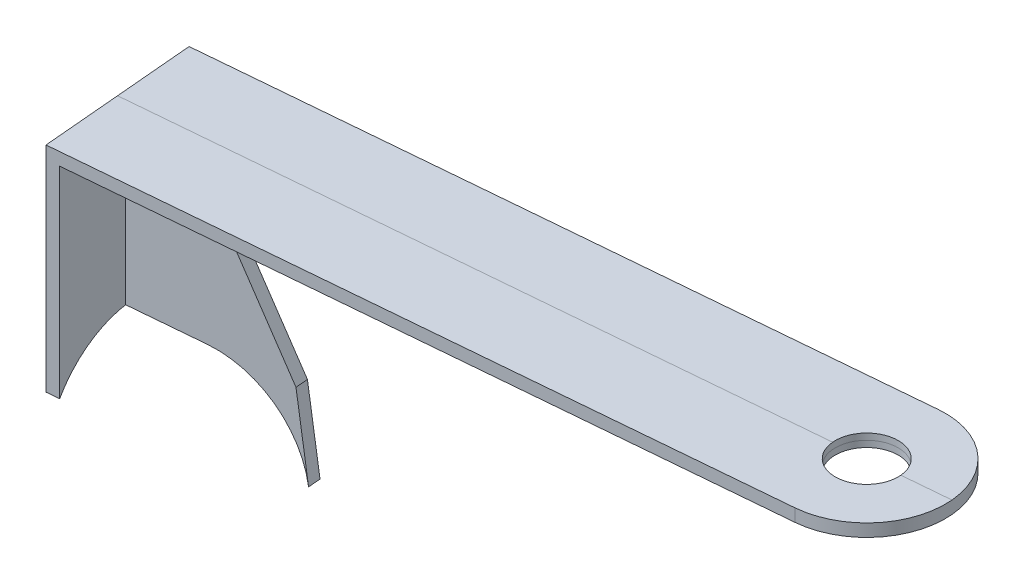
ISO-10303-21;
HEADER;
FILE_DESCRIPTION(('STEP AP214'),'2;1');
FILE_NAME('part.step','',(''),(''),'','','');
FILE_SCHEMA(('AUTOMOTIVE_DESIGN { 1 0 10303 214 1 1 1 1 }'));
ENDSEC;
DATA;
#1=APPLICATION_CONTEXT('core data for automotive mechanical design processes');
#2=APPLICATION_PROTOCOL_DEFINITION('international standard','automotive_design',2000,#1);
#3=PRODUCT_CONTEXT('',#1,'mechanical');
#4=PRODUCT('Part','Part','',(#3));
#5=PRODUCT_RELATED_PRODUCT_CATEGORY('part','',(#4));
#6=PRODUCT_DEFINITION_FORMATION('','',#4);
#7=PRODUCT_DEFINITION_CONTEXT('part definition',#1,'design');
#8=PRODUCT_DEFINITION('design','',#6,#7);
#9=PRODUCT_DEFINITION_SHAPE('','',#8);
#10=(LENGTH_UNIT() NAMED_UNIT(*) SI_UNIT(.MILLI.,.METRE.));
#11=(NAMED_UNIT(*) PLANE_ANGLE_UNIT() SI_UNIT($,.RADIAN.));
#12=(NAMED_UNIT(*) SI_UNIT($,.STERADIAN.) SOLID_ANGLE_UNIT());
#13=UNCERTAINTY_MEASURE_WITH_UNIT(LENGTH_MEASURE(1.E-05),#10,'distance_accuracy_value','');
#14=(GEOMETRIC_REPRESENTATION_CONTEXT(3) GLOBAL_UNCERTAINTY_ASSIGNED_CONTEXT((#13)) GLOBAL_UNIT_ASSIGNED_CONTEXT((#10,
#11,#12)) REPRESENTATION_CONTEXT('',''));
#15=CARTESIAN_POINT('',(0.,0.,0.));
#16=DIRECTION('',(0.,0.,1.));
#17=DIRECTION('',(1.,0.,0.));
#18=AXIS2_PLACEMENT_3D('',#15,#16,#17);
#19=CARTESIAN_POINT('',(95.5283362919159,42.2871579513113,-67.7014814945898));
#20=DIRECTION('',(0.,-1.,0.));
#21=DIRECTION('',(0.,0.,-1.));
#22=AXIS2_PLACEMENT_3D('',#19,#20,#21);
#23=CYLINDRICAL_SURFACE('',#22,5.00000000000001);
#24=CARTESIAN_POINT('',(95.5283362919159,40.2871579513113,-67.7014814945898));
#25=DIRECTION('',(0.,1.,0.));
#26=DIRECTION('',(0.,0.,1.));
#27=AXIS2_PLACEMENT_3D('',#24,#25,#26);
#28=CIRCLE('',#27,5.00000000000001);
#29=CARTESIAN_POINT('',(95.5283362919159,40.2871579513113,-62.7014814945897));
#30=VERTEX_POINT('',#29);
#31=EDGE_CURVE('E177',#30,#30,#28,.T.);
#32=ORIENTED_EDGE('',*,*,#31,.F.);
#33=EDGE_LOOP('',(#32));
#34=FACE_BOUND('',#33,.T.);
#35=CARTESIAN_POINT('',(95.5283362919159,41.2871579513113,-67.7014814945898));
#36=DIRECTION('',(0.,1.,0.));
#37=DIRECTION('',(0.,0.,1.));
#38=AXIS2_PLACEMENT_3D('',#35,#36,#37);
#39=CIRCLE('',#38,5.00000000000001);
#40=CARTESIAN_POINT('',(95.5283362919159,41.2871579513113,-62.7014814945897));
#41=VERTEX_POINT('',#40);
#42=EDGE_CURVE('E12',#41,#41,#39,.T.);
#43=ORIENTED_EDGE('',*,*,#42,.T.);
#44=EDGE_LOOP('',(#43));
#45=FACE_BOUND('',#44,.T.);
#46=ADVANCED_FACE('F50',(#34,#45),#23,.F.);
#47=CARTESIAN_POINT('',(95.5283362919159,42.2871579513113,-67.7014814945898));
#48=DIRECTION('',(0.,1.,0.));
#49=DIRECTION('',(0.,0.,1.));
#50=AXIS2_PLACEMENT_3D('',#47,#48,#49);
#51=PLANE('',#50);
#52=CARTESIAN_POINT('',(95.5283362919159,42.2871579513113,-67.7014814945898));
#53=DIRECTION('',(0.,1.,0.));
#54=DIRECTION('',(0.,0.,1.));
#55=AXIS2_PLACEMENT_3D('',#52,#53,#54);
#56=CIRCLE('',#55,12.5);
#57=CARTESIAN_POINT('',(96.6177830762615,42.2871579513113,-55.2490477684429));
#58=VERTEX_POINT('',#57);
#59=CARTESIAN_POINT('',(107.980770018063,42.2871579513113,-68.7909282789354));
#60=VERTEX_POINT('',#59);
#61=EDGE_CURVE('E288',#58,#60,#56,.T.);
#62=ORIENTED_EDGE('',*,*,#61,.T.);
#63=DIRECTION('',(-0.996194698091746,0.,0.087155742747652));
#64=VECTOR('',#63,1.);
#65=CARTESIAN_POINT('',(95.5283362919159,42.2871579513113,-67.7014814945898));
#66=LINE('',#65,#64);
#67=CARTESIAN_POINT('',(100.509309782375,42.2871579513113,-68.137260208328));
#68=VERTEX_POINT('',#67);
#69=EDGE_CURVE('E60',#60,#68,#66,.T.);
#70=ORIENTED_EDGE('',*,*,#69,.T.);
#71=CARTESIAN_POINT('',(95.5283362919159,42.2871579513113,-67.7014814945898));
#72=DIRECTION('',(0.,1.,0.));
#73=DIRECTION('',(0.,0.,1.));
#74=AXIS2_PLACEMENT_3D('',#71,#72,#73);
#75=CIRCLE('',#74,5.00000000000001);
#76=CARTESIAN_POINT('',(90.5473628014572,42.2871579513113,-67.2657027808515));
#77=VERTEX_POINT('',#76);
#78=EDGE_CURVE('E281',#77,#68,#75,.T.);
#79=ORIENTED_EDGE('',*,*,#78,.F.);
#80=CARTESIAN_POINT('',(-13.8897548470803,42.2871579513113,-58.1286389352819));
#81=VERTEX_POINT('',#80);
#82=EDGE_CURVE('E67',#77,#81,#66,.T.);
#83=ORIENTED_EDGE('',*,*,#82,.T.);
#84=DIRECTION('',(0.0871557427476517,0.,0.996194698091746));
#85=VECTOR('',#84,1.);
#86=CARTESIAN_POINT('',(-14.9792016314259,42.2871579513113,-70.5810726614287));
#87=LINE('',#86,#85);
#88=CARTESIAN_POINT('',(-12.8003080627346,42.2871579513113,-45.6762052091351));
#89=VERTEX_POINT('',#88);
#90=EDGE_CURVE('E222',#81,#89,#87,.T.);
#91=ORIENTED_EDGE('',*,*,#90,.T.);
#92=DIRECTION('',(0.996194698091746,0.,-0.087155742747652));
#93=VECTOR('',#92,1.);
#94=CARTESIAN_POINT('',(-12.8003080627346,42.2871579513113,-45.6762052091351));
#95=LINE('',#94,#93);
#96=EDGE_CURVE('E221',#89,#58,#95,.T.);
#97=ORIENTED_EDGE('',*,*,#96,.T.);
#98=EDGE_LOOP('',(#62,#70,#79,#83,#91,#97));
#99=FACE_BOUND('',#98,.T.);
#100=ADVANCED_FACE('F316',(#99),#51,.T.);
#101=CARTESIAN_POINT('',(-11.8973654508968,0.,-58.3029504207772));
#102=DIRECTION('',(-0.996194698091746,0.,0.0871557427476517));
#103=DIRECTION('',(-0.0871557427476518,0.,-0.996194698091746));
#104=AXIS2_PLACEMENT_3D('',#101,#102,#103);
#105=PLANE('',#104);
#106=DIRECTION('',(0.,1.,0.));
#107=VECTOR('',#106,1.);
#108=CARTESIAN_POINT('',(-11.9845211936444,40.2871579513113,-59.299145118869));
#109=LINE('',#108,#107);
#110=CARTESIAN_POINT('',(-11.9845211936444,15.,-59.299145118869));
#111=VERTEX_POINT('',#110);
#112=CARTESIAN_POINT('',(-11.9845211936444,40.2871579513113,-59.299145118869));
#113=VERTEX_POINT('',#112);
#114=EDGE_CURVE('E159',#111,#113,#109,.T.);
#115=ORIENTED_EDGE('',*,*,#114,.F.);
#116=DIRECTION('',(0.0871557427476518,0.,0.996194698091746));
#117=VECTOR('',#116,1.);
#118=CARTESIAN_POINT('',(-11.9845211936444,15.,-59.299145118869));
#119=LINE('',#118,#117);
#120=CARTESIAN_POINT('',(-11.8973654508968,15.,-58.3029504207772));
#121=VERTEX_POINT('',#120);
#122=EDGE_CURVE('E169',#111,#121,#119,.T.);
#123=ORIENTED_EDGE('',*,*,#122,.T.);
#124=CARTESIAN_POINT('',(-11.8973654508968,0.,-58.3029504207772));
#125=DIRECTION('',(0.996194698091746,0.,-0.0871557427476517));
#126=DIRECTION('',(-0.0871557427476518,0.,-0.996194698091746));
#127=AXIS2_PLACEMENT_3D('',#124,#125,#126);
#128=CIRCLE('',#127,15.);
#129=CARTESIAN_POINT('',(-12.9868122352424,8.2915619758885,-70.755384146924));
#130=VERTEX_POINT('',#129);
#131=EDGE_CURVE('E198',#130,#121,#128,.T.);
#132=ORIENTED_EDGE('',*,*,#131,.F.);
#133=DIRECTION('',(0.,-1.,0.));
#134=VECTOR('',#133,1.);
#135=CARTESIAN_POINT('',(-12.9868122352424,8.2915619758885,-70.755384146924));
#136=LINE('',#135,#134);
#137=CARTESIAN_POINT('',(-12.9868122352424,40.2871579513113,-70.755384146924));
#138=VERTEX_POINT('',#137);
#139=EDGE_CURVE('E246',#138,#130,#136,.T.);
#140=ORIENTED_EDGE('',*,*,#139,.F.);
#141=DIRECTION('',(-0.0871557427476519,0.,-0.996194698091746));
#142=VECTOR('',#141,1.);
#143=CARTESIAN_POINT('',(-12.9868122352424,40.2871579513113,-70.755384146924));
#144=LINE('',#143,#142);
#145=EDGE_CURVE('E182',#113,#138,#144,.T.);
#146=ORIENTED_EDGE('',*,*,#145,.F.);
#147=EDGE_LOOP('',(#115,#123,#132,#140,#146));
#148=FACE_BOUND('',#147,.T.);
#149=ADVANCED_FACE('F180',(#148),#105,.F.);
#150=CARTESIAN_POINT('',(-11.8102097081491,15.,-57.3067557226855));
#151=VERTEX_POINT('',#150);
#152=EDGE_CURVE('E173',#121,#151,#119,.T.);
#153=ORIENTED_EDGE('',*,*,#152,.T.);
#154=DIRECTION('',(0.,1.,0.));
#155=VECTOR('',#154,1.);
#156=CARTESIAN_POINT('',(-11.8102097081491,40.2871579513113,-57.3067557226855));
#157=LINE('',#156,#155);
#158=CARTESIAN_POINT('',(-11.8102097081491,40.2871579513113,-57.3067557226855));
#159=VERTEX_POINT('',#158);
#160=EDGE_CURVE('E343',#151,#159,#157,.T.);
#161=ORIENTED_EDGE('',*,*,#160,.T.);
#162=CARTESIAN_POINT('',(-10.8079186665511,40.2871579513113,-45.8505166946304));
#163=VERTEX_POINT('',#162);
#164=EDGE_CURVE('E209',#163,#159,#144,.T.);
#165=ORIENTED_EDGE('',*,*,#164,.F.);
#166=DIRECTION('',(0.,1.,0.));
#167=VECTOR('',#166,1.);
#168=CARTESIAN_POINT('',(-10.8079186665511,40.2871579513113,-45.8505166946304));
#169=LINE('',#168,#167);
#170=CARTESIAN_POINT('',(-10.8079186665511,8.2915619758885,-45.8505166946304));
#171=VERTEX_POINT('',#170);
#172=EDGE_CURVE('E203',#171,#163,#169,.T.);
#173=ORIENTED_EDGE('',*,*,#172,.F.);
#174=EDGE_CURVE('E204',#121,#171,#128,.T.);
#175=ORIENTED_EDGE('',*,*,#174,.F.);
#176=EDGE_LOOP('',(#153,#161,#165,#173,#175));
#177=FACE_BOUND('',#176,.T.);
#178=ADVANCED_FACE('F342',(#177),#105,.F.);
#179=CARTESIAN_POINT('',(95.5283362919159,40.2871579513113,-67.7014814945898));
#180=DIRECTION('',(0.,1.,0.));
#181=DIRECTION('',(0.,0.,1.));
#182=AXIS2_PLACEMENT_3D('',#179,#180,#181);
#183=PLANE('',#182);
#184=ORIENTED_EDGE('',*,*,#31,.T.);
#185=EDGE_LOOP('',(#184));
#186=FACE_BOUND('',#185,.T.);
#187=DIRECTION('',(0.996194698091746,0.,-0.0871557427476521));
#188=VECTOR('',#187,1.);
#189=CARTESIAN_POINT('',(-2.02257421272699,40.2871579513113,-60.1707025463455));
#190=LINE('',#189,#188);
#191=CARTESIAN_POINT('',(-2.02257421272699,40.2871579513113,-60.1707025463455));
#192=VERTEX_POINT('',#191);
#193=EDGE_CURVE('E183',#113,#192,#190,.T.);
#194=ORIENTED_EDGE('',*,*,#193,.F.);
#195=ORIENTED_EDGE('',*,*,#145,.T.);
#196=DIRECTION('',(-0.996194698091746,0.,0.0871557427476518));
#197=VECTOR('',#196,1.);
#198=CARTESIAN_POINT('',(-14.9792016314259,40.2871579513113,-70.5810726614287));
#199=LINE('',#198,#197);
#200=CARTESIAN_POINT('',(94.4388895075703,40.2871579513113,-80.1539152207366));
#201=VERTEX_POINT('',#200);
#202=EDGE_CURVE('E231',#201,#138,#199,.T.);
#203=ORIENTED_EDGE('',*,*,#202,.F.);
#204=CARTESIAN_POINT('',(95.5283362919159,40.2871579513113,-67.7014814945898));
#205=DIRECTION('',(0.,1.,0.));
#206=DIRECTION('',(0.,0.,1.));
#207=AXIS2_PLACEMENT_3D('',#204,#205,#206);
#208=CIRCLE('',#207,12.5);
#209=CARTESIAN_POINT('',(96.6177830762615,40.2871579513113,-55.2490477684429));
#210=VERTEX_POINT('',#209);
#211=EDGE_CURVE('E228',#210,#201,#208,.T.);
#212=ORIENTED_EDGE('',*,*,#211,.F.);
#213=DIRECTION('',(0.996194698091746,0.,-0.087155742747652));
#214=VECTOR('',#213,1.);
#215=CARTESIAN_POINT('',(-12.8003080627346,40.2871579513113,-45.6762052091351));
#216=LINE('',#215,#214);
#217=EDGE_CURVE('E235',#163,#210,#216,.T.);
#218=ORIENTED_EDGE('',*,*,#217,.F.);
#219=ORIENTED_EDGE('',*,*,#164,.T.);
#220=DIRECTION('',(0.996194698091746,0.,-0.0871557427476521));
#221=VECTOR('',#220,1.);
#222=CARTESIAN_POINT('',(-1.84826272723168,40.2871579513113,-58.178313150162));
#223=LINE('',#222,#221);
#224=CARTESIAN_POINT('',(-1.84826272723169,40.2871579513112,-58.178313150162));
#225=VERTEX_POINT('',#224);
#226=EDGE_CURVE('E346',#159,#225,#223,.T.);
#227=ORIENTED_EDGE('',*,*,#226,.T.);
#228=DIRECTION('',(0.0871557427476518,0.,0.996194698091746));
#229=VECTOR('',#228,1.);
#230=CARTESIAN_POINT('',(-2.02257421272699,40.2871579513113,-60.1707025463455));
#231=LINE('',#230,#229);
#232=EDGE_CURVE('E271',#192,#225,#231,.T.);
#233=ORIENTED_EDGE('',*,*,#232,.F.);
#234=EDGE_LOOP('',(#194,#195,#203,#212,#218,#219,#227,#233));
#235=FACE_BOUND('',#234,.T.);
#236=ADVANCED_FACE('F303',(#186,#235),#183,.F.);
#237=CARTESIAN_POINT('',(-13.8897548470803,0.,-58.1286389352819));
#238=DIRECTION('',(0.996194698091746,0.,-0.0871557427476517));
#239=DIRECTION('',(0.0871557427476518,0.,0.996194698091746));
#240=AXIS2_PLACEMENT_3D('',#237,#238,#239);
#241=CYLINDRICAL_SURFACE('',#240,15.);
#242=ORIENTED_EDGE('',*,*,#131,.T.);
#243=ORIENTED_EDGE('',*,*,#174,.T.);
#244=DIRECTION('',(0.996194698091746,0.,-0.0871557427476517));
#245=VECTOR('',#244,1.);
#246=CARTESIAN_POINT('',(-12.8003080627346,8.2915619758885,-45.6762052091351));
#247=LINE('',#246,#245);
#248=CARTESIAN_POINT('',(-12.8003080627346,8.2915619758885,-45.6762052091351));
#249=VERTEX_POINT('',#248);
#250=EDGE_CURVE('E251',#249,#171,#247,.T.);
#251=ORIENTED_EDGE('',*,*,#250,.F.);
#252=CARTESIAN_POINT('',(-13.8897548470803,0.,-58.1286389352819));
#253=DIRECTION('',(0.996194698091746,0.,-0.0871557427476517));
#254=DIRECTION('',(-0.0871557427476518,0.,-0.996194698091746));
#255=AXIS2_PLACEMENT_3D('',#252,#253,#254);
#256=CIRCLE('',#255,15.);
#257=CARTESIAN_POINT('',(-14.9792016314259,8.2915619758885,-70.5810726614287));
#258=VERTEX_POINT('',#257);
#259=EDGE_CURVE('E242',#258,#249,#256,.T.);
#260=ORIENTED_EDGE('',*,*,#259,.F.);
#261=DIRECTION('',(0.996194698091746,0.,-0.0871557427476517));
#262=VECTOR('',#261,1.);
#263=CARTESIAN_POINT('',(-14.9792016314259,8.2915619758885,-70.5810726614287));
#264=LINE('',#263,#262);
#265=EDGE_CURVE('E255',#258,#130,#264,.T.);
#266=ORIENTED_EDGE('',*,*,#265,.T.);
#267=EDGE_LOOP('',(#242,#243,#251,#260,#266));
#268=FACE_BOUND('',#267,.T.);
#269=ADVANCED_FACE('F52',(#268),#241,.F.);
#270=CARTESIAN_POINT('',(-14.9792016314259,8.2915619758885,-70.5810726614287));
#271=DIRECTION('',(-0.0871557427476518,0.,-0.996194698091746));
#272=DIRECTION('',(0.996194698091746,0.,-0.0871557427476517));
#273=AXIS2_PLACEMENT_3D('',#270,#271,#272);
#274=PLANE('',#273);
#275=ORIENTED_EDGE('',*,*,#139,.T.);
#276=ORIENTED_EDGE('',*,*,#265,.F.);
#277=DIRECTION('',(0.,-1.,0.));
#278=VECTOR('',#277,1.);
#279=CARTESIAN_POINT('',(-14.9792016314259,8.2915619758885,-70.5810726614287));
#280=LINE('',#279,#278);
#281=CARTESIAN_POINT('',(-14.9792016314259,42.2871579513113,-70.5810726614287));
#282=VERTEX_POINT('',#281);
#283=EDGE_CURVE('E205',#282,#258,#280,.T.);
#284=ORIENTED_EDGE('',*,*,#283,.F.);
#285=DIRECTION('',(-0.996194698091746,0.,0.0871557427476518));
#286=VECTOR('',#285,1.);
#287=CARTESIAN_POINT('',(-14.9792016314259,42.2871579513113,-70.5810726614287));
#288=LINE('',#287,#286);
#289=CARTESIAN_POINT('',(94.4388895075703,42.2871579513113,-80.1539152207366));
#290=VERTEX_POINT('',#289);
#291=EDGE_CURVE('E223',#290,#282,#288,.T.);
#292=ORIENTED_EDGE('',*,*,#291,.F.);
#293=DIRECTION('',(0.,-1.,0.));
#294=VECTOR('',#293,1.);
#295=CARTESIAN_POINT('',(94.4388895075703,42.2871579513113,-80.1539152207366));
#296=LINE('',#295,#294);
#297=EDGE_CURVE('E240',#290,#201,#296,.T.);
#298=ORIENTED_EDGE('',*,*,#297,.T.);
#299=ORIENTED_EDGE('',*,*,#202,.T.);
#300=EDGE_LOOP('',(#275,#276,#284,#292,#298,#299));
#301=FACE_BOUND('',#300,.T.);
#302=ADVANCED_FACE('F297',(#301),#274,.T.);
#303=CARTESIAN_POINT('',(-12.8003080627346,40.2871579513113,-45.6762052091351));
#304=DIRECTION('',(0.0871557427476518,0.,0.996194698091746));
#305=DIRECTION('',(-0.996194698091746,0.,0.0871557427476517));
#306=AXIS2_PLACEMENT_3D('',#303,#304,#305);
#307=PLANE('',#306);
#308=ORIENTED_EDGE('',*,*,#172,.T.);
#309=ORIENTED_EDGE('',*,*,#217,.T.);
#310=DIRECTION('',(0.,-1.,0.));
#311=VECTOR('',#310,1.);
#312=CARTESIAN_POINT('',(96.6177830762615,42.2871579513113,-55.2490477684429));
#313=LINE('',#312,#311);
#314=EDGE_CURVE('E227',#58,#210,#313,.T.);
#315=ORIENTED_EDGE('',*,*,#314,.F.);
#316=ORIENTED_EDGE('',*,*,#96,.F.);
#317=DIRECTION('',(0.,1.,0.));
#318=VECTOR('',#317,1.);
#319=CARTESIAN_POINT('',(-12.8003080627346,40.2871579513113,-45.6762052091351));
#320=LINE('',#319,#318);
#321=EDGE_CURVE('E245',#249,#89,#320,.T.);
#322=ORIENTED_EDGE('',*,*,#321,.F.);
#323=ORIENTED_EDGE('',*,*,#250,.T.);
#324=EDGE_LOOP('',(#308,#309,#315,#316,#322,#323));
#325=FACE_BOUND('',#324,.T.);
#326=ADVANCED_FACE('F309',(#325),#307,.T.);
#327=CARTESIAN_POINT('',(-13.8897548470803,0.,-58.1286389352819));
#328=DIRECTION('',(-0.996194698091746,0.,0.0871557427476517));
#329=DIRECTION('',(-0.0871557427476518,0.,-0.996194698091746));
#330=AXIS2_PLACEMENT_3D('',#327,#328,#329);
#331=PLANE('',#330);
#332=ORIENTED_EDGE('',*,*,#259,.T.);
#333=ORIENTED_EDGE('',*,*,#321,.T.);
#334=ORIENTED_EDGE('',*,*,#90,.F.);
#335=EDGE_CURVE('E217',#282,#81,#87,.T.);
#336=ORIENTED_EDGE('',*,*,#335,.F.);
#337=ORIENTED_EDGE('',*,*,#283,.T.);
#338=EDGE_LOOP('',(#332,#333,#334,#336,#337));
#339=FACE_BOUND('',#338,.T.);
#340=ADVANCED_FACE('F307',(#339),#331,.T.);
#341=ORIENTED_EDGE('',*,*,#69,.F.);
#342=EDGE_CURVE('E237',#60,#290,#56,.T.);
#343=ORIENTED_EDGE('',*,*,#342,.T.);
#344=ORIENTED_EDGE('',*,*,#291,.T.);
#345=ORIENTED_EDGE('',*,*,#335,.T.);
#346=ORIENTED_EDGE('',*,*,#82,.F.);
#347=EDGE_CURVE('E232',#68,#77,#75,.T.);
#348=ORIENTED_EDGE('',*,*,#347,.F.);
#349=EDGE_LOOP('',(#341,#343,#344,#345,#346,#348));
#350=FACE_BOUND('',#349,.T.);
#351=ADVANCED_FACE('F293',(#350),#51,.T.);
#352=CARTESIAN_POINT('',(95.5283362919159,42.2871579513113,-67.7014814945898));
#353=DIRECTION('',(0.,-1.,0.));
#354=DIRECTION('',(0.,0.,-1.));
#355=AXIS2_PLACEMENT_3D('',#352,#353,#354);
#356=CYLINDRICAL_SURFACE('',#355,12.5);
#357=ORIENTED_EDGE('',*,*,#211,.T.);
#358=ORIENTED_EDGE('',*,*,#297,.F.);
#359=ORIENTED_EDGE('',*,*,#342,.F.);
#360=ORIENTED_EDGE('',*,*,#61,.F.);
#361=ORIENTED_EDGE('',*,*,#314,.T.);
#362=EDGE_LOOP('',(#357,#358,#359,#360,#361));
#363=FACE_BOUND('',#362,.T.);
#364=ADVANCED_FACE('F298',(#363),#356,.T.);
#365=ORIENTED_EDGE('',*,*,#42,.F.);
#366=EDGE_LOOP('',(#365));
#367=FACE_BOUND('',#366,.T.);
#368=ORIENTED_EDGE('',*,*,#347,.T.);
#369=ORIENTED_EDGE('',*,*,#78,.T.);
#370=EDGE_LOOP('',(#368,#369));
#371=FACE_BOUND('',#370,.T.);
#372=ADVANCED_FACE('F323',(#367,#371),#23,.F.);
#373=CARTESIAN_POINT('',(-0.0301848165434404,15.,-60.3450140318408));
#374=DIRECTION('',(0.,1.,0.));
#375=DIRECTION('',(-1.,0.,0.));
#376=AXIS2_PLACEMENT_3D('',#373,#374,#375);
#377=PLANE('',#376);
#378=DIRECTION('',(-0.996194698091746,0.,0.087155742747652));
#379=VECTOR('',#378,1.);
#380=CARTESIAN_POINT('',(0.144126668951863,15.,-58.3526246356573));
#381=LINE('',#380,#379);
#382=CARTESIAN_POINT('',(0.144126668951864,15.,-58.3526246356573));
#383=VERTEX_POINT('',#382);
#384=EDGE_CURVE('E352',#383,#151,#381,.T.);
#385=ORIENTED_EDGE('',*,*,#384,.T.);
#386=ORIENTED_EDGE('',*,*,#152,.F.);
#387=ORIENTED_EDGE('',*,*,#122,.F.);
#388=DIRECTION('',(-0.996194698091746,0.,0.087155742747652));
#389=VECTOR('',#388,1.);
#390=CARTESIAN_POINT('',(-0.0301848165434404,15.,-60.3450140318408));
#391=LINE('',#390,#389);
#392=CARTESIAN_POINT('',(-0.0301848165434395,15.,-60.3450140318408));
#393=VERTEX_POINT('',#392);
#394=EDGE_CURVE('E155',#393,#111,#391,.T.);
#395=ORIENTED_EDGE('',*,*,#394,.F.);
#396=DIRECTION('',(0.0871557427476518,0.,0.996194698091746));
#397=VECTOR('',#396,1.);
#398=CARTESIAN_POINT('',(-0.0301848165434395,15.,-60.3450140318408));
#399=LINE('',#398,#397);
#400=EDGE_CURVE('E361',#393,#383,#399,.T.);
#401=ORIENTED_EDGE('',*,*,#400,.T.);
#402=EDGE_LOOP('',(#385,#386,#387,#395,#401));
#403=FACE_BOUND('',#402,.T.);
#404=ADVANCED_FACE('F171',(#403),#377,.F.);
#405=CARTESIAN_POINT('',(12.9203462586492,15.,-61.4780386875603));
#406=DIRECTION('',(-0.856794618893761,-0.510180367126637,0.074959816123213));
#407=DIRECTION('',(0.511619781114987,-0.859211964285794,0.));
#408=AXIS2_PLACEMENT_3D('',#405,#406,#407);
#409=PLANE('',#408);
#410=DIRECTION('',(0.508238976802056,-0.860067435145948,-0.0444651488321916));
#411=VECTOR('',#410,1.);
#412=CARTESIAN_POINT('',(13.0946577441445,15.,-59.4856492913768));
#413=LINE('',#412,#411);
#414=CARTESIAN_POINT('',(13.0946577441445,15.,-59.4856492913768));
#415=VERTEX_POINT('',#414);
#416=EDGE_CURVE('E348',#225,#415,#413,.T.);
#417=ORIENTED_EDGE('',*,*,#416,.T.);
#418=DIRECTION('',(0.0871557427476518,0.,0.996194698091746));
#419=VECTOR('',#418,1.);
#420=CARTESIAN_POINT('',(12.9203462586492,15.,-61.4780386875603));
#421=LINE('',#420,#419);
#422=CARTESIAN_POINT('',(12.9203462586492,15.,-61.4780386875603));
#423=VERTEX_POINT('',#422);
#424=EDGE_CURVE('E275',#423,#415,#421,.T.);
#425=ORIENTED_EDGE('',*,*,#424,.F.);
#426=DIRECTION('',(0.508238976802056,-0.860067435145948,-0.0444651488321916));
#427=VECTOR('',#426,1.);
#428=CARTESIAN_POINT('',(12.9203462586492,15.,-61.4780386875603));
#429=LINE('',#428,#427);
#430=EDGE_CURVE('E185',#192,#423,#429,.T.);
#431=ORIENTED_EDGE('',*,*,#430,.F.);
#432=ORIENTED_EDGE('',*,*,#232,.T.);
#433=EDGE_LOOP('',(#417,#425,#431,#432));
#434=FACE_BOUND('',#433,.T.);
#435=ADVANCED_FACE('F335',(#434),#409,.F.);
#436=CARTESIAN_POINT('',(12.9203462586492,15.,-61.4780386875603));
#437=DIRECTION('',(-0.986081046334469,-0.142131979695436,0.086270912872041));
#438=DIRECTION('',(0.142663871303863,-0.989771195693527,0.));
#439=AXIS2_PLACEMENT_3D('',#436,#437,#438);
#440=PLANE('',#439);
#441=DIRECTION('',(0.141591124601877,-0.98984771573604,-0.0123876182585501));
#442=VECTOR('',#441,1.);
#443=CARTESIAN_POINT('',(13.0946577441445,15.,-59.4856492913768));
#444=LINE('',#443,#442);
#445=CARTESIAN_POINT('',(14.9353423639689,2.13197969543153,-59.6466883287379));
#446=VERTEX_POINT('',#445);
#447=EDGE_CURVE('E350',#415,#446,#444,.T.);
#448=ORIENTED_EDGE('',*,*,#447,.T.);
#449=DIRECTION('',(0.0871557427476518,0.,0.996194698091746));
#450=VECTOR('',#449,1.);
#451=CARTESIAN_POINT('',(14.7610308784736,2.13197969543153,-61.6390777249214));
#452=LINE('',#451,#450);
#453=CARTESIAN_POINT('',(14.7610308784736,2.13197969543153,-61.6390777249214));
#454=VERTEX_POINT('',#453);
#455=EDGE_CURVE('E374',#454,#446,#452,.T.);
#456=ORIENTED_EDGE('',*,*,#455,.F.);
#457=DIRECTION('',(0.141591124601877,-0.98984771573604,-0.0123876182585501));
#458=VECTOR('',#457,1.);
#459=CARTESIAN_POINT('',(12.9203462586492,15.,-61.4780386875603));
#460=LINE('',#459,#458);
#461=EDGE_CURVE('E365',#423,#454,#460,.T.);
#462=ORIENTED_EDGE('',*,*,#461,.F.);
#463=ORIENTED_EDGE('',*,*,#424,.T.);
#464=EDGE_LOOP('',(#448,#456,#462,#463));
#465=FACE_BOUND('',#464,.T.);
#466=ADVANCED_FACE('F379',(#465),#440,.F.);
#467=CARTESIAN_POINT('',(-0.0301848165434404,0.,-60.3450140318408));
#468=DIRECTION('',(0.0871557427476518,0.,0.996194698091746));
#469=DIRECTION('',(0.996194698091746,0.,-0.0871557427476518));
#470=AXIS2_PLACEMENT_3D('',#467,#468,#469);
#471=CYLINDRICAL_SURFACE('',#470,15.);
#472=CARTESIAN_POINT('',(0.144126668951863,0.,-58.3526246356573));
#473=DIRECTION('',(0.0871557427476518,0.,0.996194698091746));
#474=DIRECTION('',(0.996194698091746,0.,-0.0871557427476518));
#475=AXIS2_PLACEMENT_3D('',#472,#473,#474);
#476=CIRCLE('',#475,15.);
#477=EDGE_CURVE('E166',#446,#383,#476,.T.);
#478=ORIENTED_EDGE('',*,*,#477,.T.);
#479=ORIENTED_EDGE('',*,*,#400,.F.);
#480=CARTESIAN_POINT('',(-0.0301848165434404,0.,-60.3450140318408));
#481=DIRECTION('',(0.0871557427476518,0.,0.996194698091746));
#482=DIRECTION('',(0.996194698091746,0.,-0.0871557427476518));
#483=AXIS2_PLACEMENT_3D('',#480,#481,#482);
#484=CIRCLE('',#483,15.);
#485=EDGE_CURVE('E162',#454,#393,#484,.T.);
#486=ORIENTED_EDGE('',*,*,#485,.F.);
#487=ORIENTED_EDGE('',*,*,#455,.T.);
#488=EDGE_LOOP('',(#478,#479,#486,#487));
#489=FACE_BOUND('',#488,.T.);
#490=ADVANCED_FACE('F372',(#489),#471,.F.);
#491=CARTESIAN_POINT('',(-0.0301848165434404,0.,-60.3450140318408));
#492=DIRECTION('',(0.0871557427476518,0.,0.996194698091746));
#493=DIRECTION('',(0.996194698091746,0.,-0.0871557427476518));
#494=AXIS2_PLACEMENT_3D('',#491,#492,#493);
#495=PLANE('',#494);
#496=ORIENTED_EDGE('',*,*,#394,.T.);
#497=ORIENTED_EDGE('',*,*,#114,.T.);
#498=ORIENTED_EDGE('',*,*,#193,.T.);
#499=ORIENTED_EDGE('',*,*,#430,.T.);
#500=ORIENTED_EDGE('',*,*,#461,.T.);
#501=ORIENTED_EDGE('',*,*,#485,.T.);
#502=EDGE_LOOP('',(#496,#497,#498,#499,#500,#501));
#503=FACE_BOUND('',#502,.T.);
#504=ADVANCED_FACE('F157',(#503),#495,.F.);
#505=CARTESIAN_POINT('',(0.144126668951863,0.,-58.3526246356573));
#506=DIRECTION('',(0.0871557427476518,0.,0.996194698091746));
#507=DIRECTION('',(0.996194698091746,0.,-0.0871557427476518));
#508=AXIS2_PLACEMENT_3D('',#505,#506,#507);
#509=PLANE('',#508);
#510=ORIENTED_EDGE('',*,*,#384,.F.);
#511=ORIENTED_EDGE('',*,*,#477,.F.);
#512=ORIENTED_EDGE('',*,*,#447,.F.);
#513=ORIENTED_EDGE('',*,*,#416,.F.);
#514=ORIENTED_EDGE('',*,*,#226,.F.);
#515=ORIENTED_EDGE('',*,*,#160,.F.);
#516=EDGE_LOOP('',(#510,#511,#512,#513,#514,#515));
#517=FACE_BOUND('',#516,.T.);
#518=ADVANCED_FACE('F368',(#517),#509,.T.);
#519=CLOSED_SHELL('',(#46,#100,#149,#178,#236,#269,#302,#326,#340,#351,#364,#372,#404,#435,#466,
#490,#504,#518));
#520=MANIFOLD_SOLID_BREP('B2',#519);
#521=ADVANCED_BREP_SHAPE_REPRESENTATION('',(#18,#520),#14);
#522=SHAPE_DEFINITION_REPRESENTATION(#9,#521);
ENDSEC;
END-ISO-10303-21;
